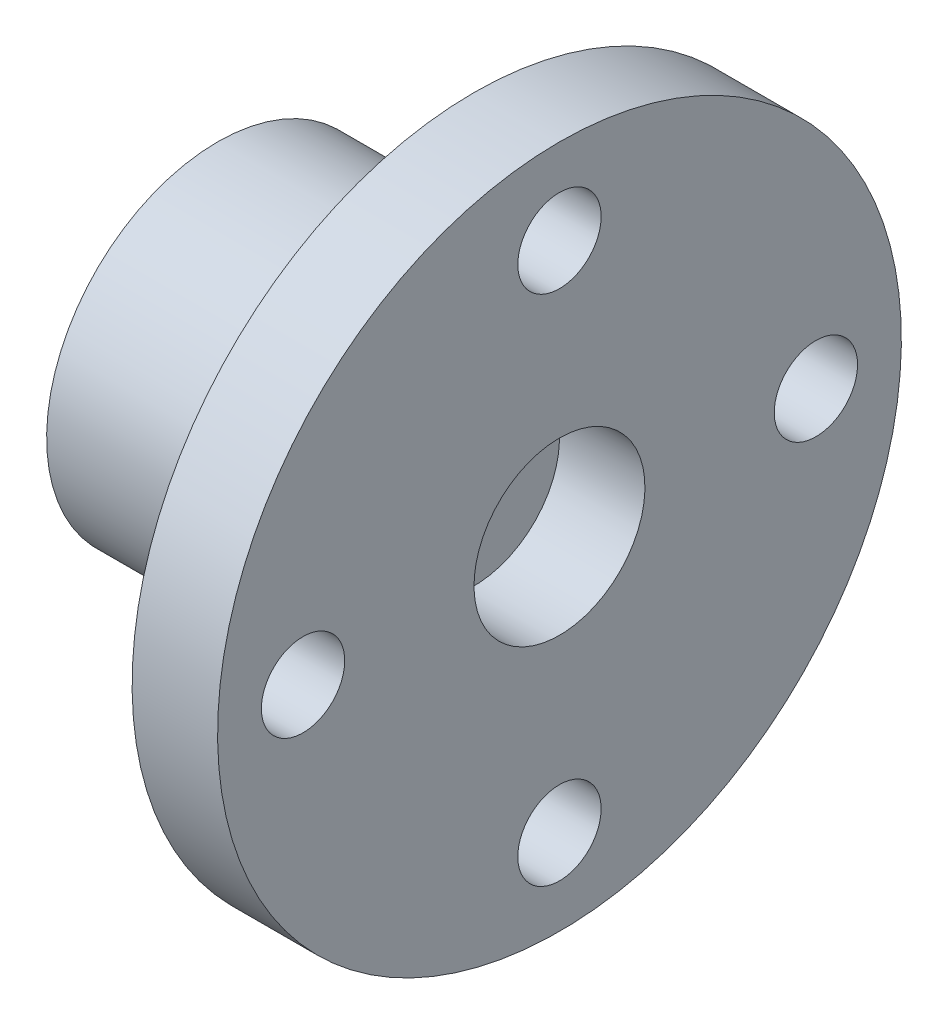
ISO-10303-21;
HEADER;
FILE_DESCRIPTION(('STEP AP214'),'2;1');
FILE_NAME('part.step','',(''),(''),'','','');
FILE_SCHEMA(('AUTOMOTIVE_DESIGN { 1 0 10303 214 1 1 1 1 }'));
ENDSEC;
DATA;
#1=APPLICATION_CONTEXT('core data for automotive mechanical design processes');
#2=APPLICATION_PROTOCOL_DEFINITION('international standard','automotive_design',2000,#1);
#3=PRODUCT_CONTEXT('',#1,'mechanical');
#4=PRODUCT('Part','Part','',(#3));
#5=PRODUCT_RELATED_PRODUCT_CATEGORY('part','',(#4));
#6=PRODUCT_DEFINITION_FORMATION('','',#4);
#7=PRODUCT_DEFINITION_CONTEXT('part definition',#1,'design');
#8=PRODUCT_DEFINITION('design','',#6,#7);
#9=PRODUCT_DEFINITION_SHAPE('','',#8);
#10=(LENGTH_UNIT() NAMED_UNIT(*) SI_UNIT(.MILLI.,.METRE.));
#11=(NAMED_UNIT(*) PLANE_ANGLE_UNIT() SI_UNIT($,.RADIAN.));
#12=(NAMED_UNIT(*) SI_UNIT($,.STERADIAN.) SOLID_ANGLE_UNIT());
#13=UNCERTAINTY_MEASURE_WITH_UNIT(LENGTH_MEASURE(1.E-05),#10,'distance_accuracy_value','');
#14=(GEOMETRIC_REPRESENTATION_CONTEXT(3) GLOBAL_UNCERTAINTY_ASSIGNED_CONTEXT((#13)) GLOBAL_UNIT_ASSIGNED_CONTEXT((#10,
#11,#12)) REPRESENTATION_CONTEXT('',''));
#15=CARTESIAN_POINT('',(0.,0.,0.));
#16=DIRECTION('',(0.,0.,1.));
#17=DIRECTION('',(1.,0.,0.));
#18=AXIS2_PLACEMENT_3D('',#15,#16,#17);
#19=CARTESIAN_POINT('',(-1.49999000020989,1.74864743221085E-11,-481.831385650782));
#20=DIRECTION('',(-1.,-3.56744395928794E-13,3.81916720471054E-13));
#21=DIRECTION('',(3.56744395928794E-13,-1.,0.));
#22=AXIS2_PLACEMENT_3D('',#19,#20,#21);
#23=CYLINDRICAL_SURFACE('',#22,8.);
#24=CARTESIAN_POINT('',(-1.49999000020989,1.74864743221085E-11,-481.831385650782));
#25=DIRECTION('',(-1.,-3.56744395928794E-13,3.81916720471054E-13));
#26=DIRECTION('',(-3.56744395928794E-13,1.,0.));
#27=AXIS2_PLACEMENT_3D('',#24,#25,#26);
#28=CIRCLE('',#27,8.);
#29=CARTESIAN_POINT('',(-1.49999000021275,8.00000000001748,-481.831385650782));
#30=VERTEX_POINT('',#29);
#31=EDGE_CURVE('E37',#30,#30,#28,.T.);
#32=ORIENTED_EDGE('',*,*,#31,.T.);
#33=EDGE_LOOP('',(#32));
#34=FACE_BOUND('',#33,.T.);
#35=CARTESIAN_POINT('',(-13.4999900002099,1.32055415709629E-11,-481.831385650778));
#36=DIRECTION('',(-1.,-3.56744395928794E-13,3.81916720471054E-13));
#37=DIRECTION('',(-3.56744395928794E-13,1.,0.));
#38=AXIS2_PLACEMENT_3D('',#35,#36,#37);
#39=CIRCLE('',#38,8.);
#40=CARTESIAN_POINT('',(-13.4999900002128,8.0000000000132,-481.831385650778));
#41=VERTEX_POINT('',#40);
#42=EDGE_CURVE('E41',#41,#41,#39,.T.);
#43=ORIENTED_EDGE('',*,*,#42,.F.);
#44=EDGE_LOOP('',(#43));
#45=FACE_BOUND('',#44,.T.);
#46=ADVANCED_FACE('F31',(#34,#45),#23,.T.);
#47=CARTESIAN_POINT('',(-13.4999900002099,1.32055415709629E-11,-481.831385650778));
#48=DIRECTION('',(1.,3.56744395928794E-13,-3.81916720471054E-13));
#49=DIRECTION('',(-3.56744395928794E-13,1.,0.));
#50=AXIS2_PLACEMENT_3D('',#47,#48,#49);
#51=PLANE('',#50);
#52=ORIENTED_EDGE('',*,*,#42,.T.);
#53=EDGE_LOOP('',(#52));
#54=FACE_BOUND('',#53,.T.);
#55=ADVANCED_FACE('F111',(#54),#51,.F.);
#56=CARTESIAN_POINT('',(2.50000999979011,1.89134519058236E-11,-481.831385650784));
#57=DIRECTION('',(1.,3.56744395928794E-13,-3.81916720471054E-13));
#58=DIRECTION('',(-3.56744395928794E-13,1.,0.));
#59=AXIS2_PLACEMENT_3D('',#56,#57,#58);
#60=PLANE('',#59);
#61=CARTESIAN_POINT('',(2.50000999978567,11.9999999999834,-481.831385650784));
#62=DIRECTION('',(-1.,-3.56744395928794E-13,3.81916720471054E-13));
#63=DIRECTION('',(-3.56744395928794E-13,1.,0.));
#64=AXIS2_PLACEMENT_3D('',#61,#62,#63);
#65=CIRCLE('',#64,1.95);
#66=CARTESIAN_POINT('',(2.50000999978497,13.9499999999834,-481.831385650784));
#67=VERTEX_POINT('',#66);
#68=EDGE_CURVE('E75',#67,#67,#65,.T.);
#69=ORIENTED_EDGE('',*,*,#68,.T.);
#70=EDGE_LOOP('',(#69));
#71=FACE_BOUND('',#70,.T.);
#72=CARTESIAN_POINT('',(2.50000999979455,8.91864557265945E-13,-469.831385650783));
#73=DIRECTION('',(-1.,-3.56744395928794E-13,3.81916720471054E-13));
#74=DIRECTION('',(-3.56744395928794E-13,1.,0.));
#75=AXIS2_PLACEMENT_3D('',#72,#73,#74);
#76=CIRCLE('',#75,1.95);
#77=CARTESIAN_POINT('',(2.50000999979385,1.95000000000089,-469.831385650783));
#78=VERTEX_POINT('',#77);
#79=EDGE_CURVE('E69',#78,#78,#76,.T.);
#80=ORIENTED_EDGE('',*,*,#79,.T.);
#81=EDGE_LOOP('',(#80));
#82=FACE_BOUND('',#81,.T.);
#83=CARTESIAN_POINT('',(2.50000999979433,-11.9999999999816,-481.831385650784));
#84=DIRECTION('',(-1.,-3.56744395928794E-13,3.81916720471054E-13));
#85=DIRECTION('',(-3.56744395928794E-13,1.,0.));
#86=AXIS2_PLACEMENT_3D('',#83,#84,#85);
#87=CIRCLE('',#86,1.95);
#88=CARTESIAN_POINT('',(2.50000999979363,-10.0499999999816,-481.831385650784));
#89=VERTEX_POINT('',#88);
#90=EDGE_CURVE('E63',#89,#89,#87,.T.);
#91=ORIENTED_EDGE('',*,*,#90,.T.);
#92=EDGE_LOOP('',(#91));
#93=FACE_BOUND('',#92,.T.);
#94=CARTESIAN_POINT('',(2.50000999978539,8.91864557265945E-13,-493.831385650784));
#95=DIRECTION('',(-1.,-3.56744395928794E-13,3.81916720471054E-13));
#96=DIRECTION('',(-3.56744395928794E-13,1.,0.));
#97=AXIS2_PLACEMENT_3D('',#94,#95,#96);
#98=CIRCLE('',#97,1.95);
#99=CARTESIAN_POINT('',(2.5000099997847,1.95000000000089,-493.831385650784));
#100=VERTEX_POINT('',#99);
#101=EDGE_CURVE('E57',#100,#100,#98,.T.);
#102=ORIENTED_EDGE('',*,*,#101,.T.);
#103=EDGE_LOOP('',(#102));
#104=FACE_BOUND('',#103,.T.);
#105=CARTESIAN_POINT('',(2.50000999979011,1.89134519058236E-11,-481.831385650784));
#106=DIRECTION('',(-1.,-3.56744395928794E-13,3.81916720471054E-13));
#107=DIRECTION('',(-3.56744395928794E-13,1.,0.));
#108=AXIS2_PLACEMENT_3D('',#105,#106,#107);
#109=CIRCLE('',#108,16.);
#110=CARTESIAN_POINT('',(2.5000099997844,16.0000000000189,-481.831385650784));
#111=VERTEX_POINT('',#110);
#112=EDGE_CURVE('E46',#111,#111,#109,.T.);
#113=ORIENTED_EDGE('',*,*,#112,.F.);
#114=EDGE_LOOP('',(#113));
#115=FACE_BOUND('',#114,.T.);
#116=CARTESIAN_POINT('',(2.50000999979011,1.89134519058236E-11,-481.831385650784));
#117=DIRECTION('',(-1.,-3.56744395928794E-13,3.81916720471054E-13));
#118=DIRECTION('',(-3.56744395928794E-13,1.,0.));
#119=AXIS2_PLACEMENT_3D('',#116,#117,#118);
#120=CIRCLE('',#119,3.999995);
#121=CARTESIAN_POINT('',(2.50000999978868,3.99999500001891,-481.831385650784));
#122=VERTEX_POINT('',#121);
#123=EDGE_CURVE('E51',#122,#122,#120,.T.);
#124=ORIENTED_EDGE('',*,*,#123,.T.);
#125=EDGE_LOOP('',(#124));
#126=FACE_BOUND('',#125,.T.);
#127=ADVANCED_FACE('F88',(#71,#82,#93,#104,#115,#126),#60,.T.);
#128=CARTESIAN_POINT('',(-1.49999000020989,1.74864743221085E-11,-481.831385650782));
#129=DIRECTION('',(1.,3.56744395928794E-13,-3.81916720471054E-13));
#130=DIRECTION('',(-3.56744395928794E-13,1.,0.));
#131=AXIS2_PLACEMENT_3D('',#128,#129,#130);
#132=PLANE('',#131);
#133=CARTESIAN_POINT('',(-1.49999000021434,11.999999999982,-481.831385650782));
#134=DIRECTION('',(-1.,-3.56744395928794E-13,3.81916720471054E-13));
#135=DIRECTION('',(-3.56744395928794E-13,1.,0.));
#136=AXIS2_PLACEMENT_3D('',#133,#134,#135);
#137=CIRCLE('',#136,1.95);
#138=CARTESIAN_POINT('',(-1.49999000021503,13.949999999982,-481.831385650782));
#139=VERTEX_POINT('',#138);
#140=EDGE_CURVE('E56',#139,#139,#137,.T.);
#141=ORIENTED_EDGE('',*,*,#140,.F.);
#142=EDGE_LOOP('',(#141));
#143=FACE_BOUND('',#142,.T.);
#144=CARTESIAN_POINT('',(-1.49999000020545,-5.3511302644923E-13,-469.831385650782));
#145=DIRECTION('',(-1.,-3.56744395928794E-13,3.81916720471054E-13));
#146=DIRECTION('',(-3.56744395928794E-13,1.,0.));
#147=AXIS2_PLACEMENT_3D('',#144,#145,#146);
#148=CIRCLE('',#147,1.95);
#149=CARTESIAN_POINT('',(-1.49999000020615,1.94999999999946,-469.831385650782));
#150=VERTEX_POINT('',#149);
#151=EDGE_CURVE('E72',#150,#150,#148,.T.);
#152=ORIENTED_EDGE('',*,*,#151,.F.);
#153=EDGE_LOOP('',(#152));
#154=FACE_BOUND('',#153,.T.);
#155=CARTESIAN_POINT('',(-1.49999000020568,-11.999999999983,-481.831385650782));
#156=DIRECTION('',(-1.,-3.56744395928794E-13,3.81916720471054E-13));
#157=DIRECTION('',(-3.56744395928794E-13,1.,0.));
#158=AXIS2_PLACEMENT_3D('',#155,#156,#157);
#159=CIRCLE('',#158,1.95);
#160=CARTESIAN_POINT('',(-1.49999000020637,-10.049999999983,-481.831385650782));
#161=VERTEX_POINT('',#160);
#162=EDGE_CURVE('E66',#161,#161,#159,.T.);
#163=ORIENTED_EDGE('',*,*,#162,.F.);
#164=EDGE_LOOP('',(#163));
#165=FACE_BOUND('',#164,.T.);
#166=CARTESIAN_POINT('',(-1.49999000021461,-5.3511302644923E-13,-493.831385650783));
#167=DIRECTION('',(-1.,-3.56744395928794E-13,3.81916720471054E-13));
#168=DIRECTION('',(-3.56744395928794E-13,1.,0.));
#169=AXIS2_PLACEMENT_3D('',#166,#167,#168);
#170=CIRCLE('',#169,1.95);
#171=CARTESIAN_POINT('',(-1.49999000021531,1.94999999999946,-493.831385650783));
#172=VERTEX_POINT('',#171);
#173=EDGE_CURVE('E60',#172,#172,#170,.T.);
#174=ORIENTED_EDGE('',*,*,#173,.F.);
#175=EDGE_LOOP('',(#174));
#176=FACE_BOUND('',#175,.T.);
#177=ORIENTED_EDGE('',*,*,#31,.F.);
#178=EDGE_LOOP('',(#177));
#179=FACE_BOUND('',#178,.T.);
#180=CARTESIAN_POINT('',(-1.49999000020989,1.74864743221085E-11,-481.831385650782));
#181=DIRECTION('',(-1.,-3.56744395928794E-13,3.81916720471054E-13));
#182=DIRECTION('',(-3.56744395928794E-13,1.,0.));
#183=AXIS2_PLACEMENT_3D('',#180,#181,#182);
#184=CIRCLE('',#183,16.);
#185=CARTESIAN_POINT('',(-1.4999900002156,16.0000000000175,-481.831385650782));
#186=VERTEX_POINT('',#185);
#187=EDGE_CURVE('E48',#186,#186,#184,.T.);
#188=ORIENTED_EDGE('',*,*,#187,.T.);
#189=EDGE_LOOP('',(#188));
#190=FACE_BOUND('',#189,.T.);
#191=ADVANCED_FACE('F84',(#143,#154,#165,#176,#179,#190),#132,.F.);
#192=CARTESIAN_POINT('',(2.50000999979011,1.89134519058236E-11,-481.831385650784));
#193=DIRECTION('',(-1.,-3.56744395928794E-13,3.81916720471054E-13));
#194=DIRECTION('',(3.56744395928794E-13,-1.,0.));
#195=AXIS2_PLACEMENT_3D('',#192,#193,#194);
#196=CYLINDRICAL_SURFACE('',#195,16.);
#197=ORIENTED_EDGE('',*,*,#112,.T.);
#198=EDGE_LOOP('',(#197));
#199=FACE_BOUND('',#198,.T.);
#200=ORIENTED_EDGE('',*,*,#187,.F.);
#201=EDGE_LOOP('',(#200));
#202=FACE_BOUND('',#201,.T.);
#203=ADVANCED_FACE('F87',(#199,#202),#196,.T.);
#204=CARTESIAN_POINT('',(2.50000999979011,1.89134519058236E-11,-481.831385650784));
#205=DIRECTION('',(-1.,-3.56744395928794E-13,3.81916720471054E-13));
#206=DIRECTION('',(3.56744395928794E-13,-1.,0.));
#207=AXIS2_PLACEMENT_3D('',#204,#205,#206);
#208=CYLINDRICAL_SURFACE('',#207,3.999995);
#209=ORIENTED_EDGE('',*,*,#123,.F.);
#210=EDGE_LOOP('',(#209));
#211=FACE_BOUND('',#210,.T.);
#212=CARTESIAN_POINT('',(-1.49999000020989,1.74864743221085E-11,-481.831385650782));
#213=DIRECTION('',(-1.,-3.56744395928794E-13,3.81916720471054E-13));
#214=DIRECTION('',(-3.56744395928794E-13,1.,0.));
#215=AXIS2_PLACEMENT_3D('',#212,#213,#214);
#216=CIRCLE('',#215,3.999995);
#217=CARTESIAN_POINT('',(-1.49999000021132,3.99999500001749,-481.831385650782));
#218=VERTEX_POINT('',#217);
#219=EDGE_CURVE('E10',#218,#218,#216,.F.);
#220=ORIENTED_EDGE('',*,*,#219,.F.);
#221=EDGE_LOOP('',(#220));
#222=FACE_BOUND('',#221,.T.);
#223=ADVANCED_FACE('F100',(#211,#222),#208,.F.);
#224=CARTESIAN_POINT('',(-1.49999000020989,1.74864743221085E-11,-481.831385650782));
#225=DIRECTION('',(1.,3.56744395928794E-13,-3.81916720471054E-13));
#226=DIRECTION('',(-3.56744395928794E-13,1.,0.));
#227=AXIS2_PLACEMENT_3D('',#224,#225,#226);
#228=PLANE('',#227);
#229=ORIENTED_EDGE('',*,*,#219,.T.);
#230=EDGE_LOOP('',(#229));
#231=FACE_BOUND('',#230,.T.);
#232=ADVANCED_FACE('F106',(#231),#228,.T.);
#233=CARTESIAN_POINT('',(-1.49999000021461,-5.3511302644923E-13,-493.831385650783));
#234=DIRECTION('',(1.,3.56744395928794E-13,-3.81916720471054E-13));
#235=DIRECTION('',(-3.56744395928794E-13,1.,0.));
#236=AXIS2_PLACEMENT_3D('',#233,#234,#235);
#237=CYLINDRICAL_SURFACE('',#236,1.95);
#238=ORIENTED_EDGE('',*,*,#173,.T.);
#239=EDGE_LOOP('',(#238));
#240=FACE_BOUND('',#239,.T.);
#241=ORIENTED_EDGE('',*,*,#101,.F.);
#242=EDGE_LOOP('',(#241));
#243=FACE_BOUND('',#242,.T.);
#244=ADVANCED_FACE('F124',(#240,#243),#237,.F.);
#245=CARTESIAN_POINT('',(-1.49999000020568,-11.999999999983,-481.831385650782));
#246=DIRECTION('',(1.,3.56744395928794E-13,-3.81916720471054E-13));
#247=DIRECTION('',(-3.56744395928794E-13,1.,0.));
#248=AXIS2_PLACEMENT_3D('',#245,#246,#247);
#249=CYLINDRICAL_SURFACE('',#248,1.95);
#250=ORIENTED_EDGE('',*,*,#162,.T.);
#251=EDGE_LOOP('',(#250));
#252=FACE_BOUND('',#251,.T.);
#253=ORIENTED_EDGE('',*,*,#90,.F.);
#254=EDGE_LOOP('',(#253));
#255=FACE_BOUND('',#254,.T.);
#256=ADVANCED_FACE('F128',(#252,#255),#249,.F.);
#257=CARTESIAN_POINT('',(-1.49999000020545,-5.3511302644923E-13,-469.831385650782));
#258=DIRECTION('',(1.,3.56744395928794E-13,-3.81916720471054E-13));
#259=DIRECTION('',(-3.56744395928794E-13,1.,0.));
#260=AXIS2_PLACEMENT_3D('',#257,#258,#259);
#261=CYLINDRICAL_SURFACE('',#260,1.95);
#262=ORIENTED_EDGE('',*,*,#151,.T.);
#263=EDGE_LOOP('',(#262));
#264=FACE_BOUND('',#263,.T.);
#265=ORIENTED_EDGE('',*,*,#79,.F.);
#266=EDGE_LOOP('',(#265));
#267=FACE_BOUND('',#266,.T.);
#268=ADVANCED_FACE('F134',(#264,#267),#261,.F.);
#269=CARTESIAN_POINT('',(-1.49999000021434,11.999999999982,-481.831385650782));
#270=DIRECTION('',(1.,3.56744395928794E-13,-3.81916720471054E-13));
#271=DIRECTION('',(-3.56744395928794E-13,1.,0.));
#272=AXIS2_PLACEMENT_3D('',#269,#270,#271);
#273=CYLINDRICAL_SURFACE('',#272,1.95);
#274=ORIENTED_EDGE('',*,*,#140,.T.);
#275=EDGE_LOOP('',(#274));
#276=FACE_BOUND('',#275,.T.);
#277=ORIENTED_EDGE('',*,*,#68,.F.);
#278=EDGE_LOOP('',(#277));
#279=FACE_BOUND('',#278,.T.);
#280=ADVANCED_FACE('F81',(#276,#279),#273,.F.);
#281=CLOSED_SHELL('',(#46,#55,#127,#191,#203,#223,#232,#244,#256,#268,#280));
#282=MANIFOLD_SOLID_BREP('B2',#281);
#283=ADVANCED_BREP_SHAPE_REPRESENTATION('',(#18,#282),#14);
#284=SHAPE_DEFINITION_REPRESENTATION(#9,#283);
ENDSEC;
END-ISO-10303-21;
